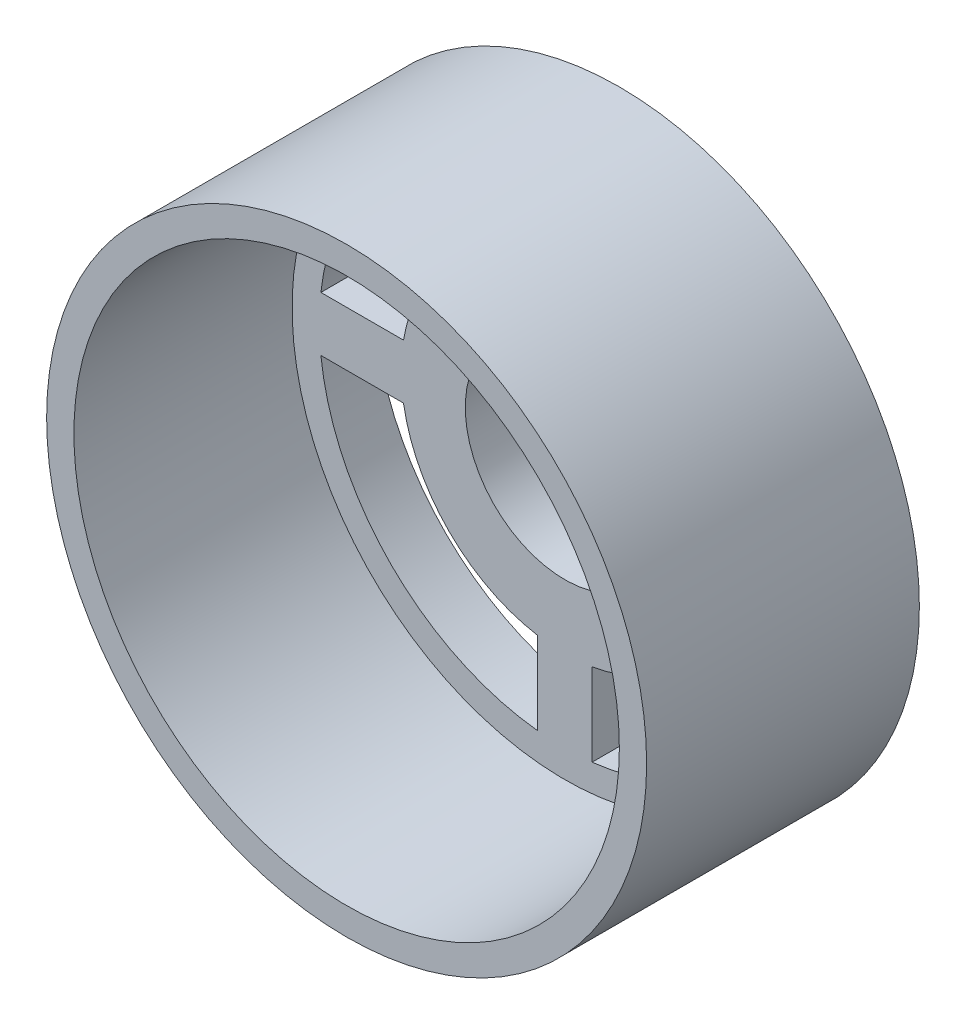
ISO-10303-21;
HEADER;
FILE_DESCRIPTION(('STEP AP214'),'2;1');
FILE_NAME('part.step','',(''),(''),'','','');
FILE_SCHEMA(('AUTOMOTIVE_DESIGN { 1 0 10303 214 1 1 1 1 }'));
ENDSEC;
DATA;
#1=APPLICATION_CONTEXT('core data for automotive mechanical design processes');
#2=APPLICATION_PROTOCOL_DEFINITION('international standard','automotive_design',2000,#1);
#3=PRODUCT_CONTEXT('',#1,'mechanical');
#4=PRODUCT('Part','Part','',(#3));
#5=PRODUCT_RELATED_PRODUCT_CATEGORY('part','',(#4));
#6=PRODUCT_DEFINITION_FORMATION('','',#4);
#7=PRODUCT_DEFINITION_CONTEXT('part definition',#1,'design');
#8=PRODUCT_DEFINITION('design','',#6,#7);
#9=PRODUCT_DEFINITION_SHAPE('','',#8);
#10=(LENGTH_UNIT() NAMED_UNIT(*) SI_UNIT(.MILLI.,.METRE.));
#11=(NAMED_UNIT(*) PLANE_ANGLE_UNIT() SI_UNIT($,.RADIAN.));
#12=(NAMED_UNIT(*) SI_UNIT($,.STERADIAN.) SOLID_ANGLE_UNIT());
#13=UNCERTAINTY_MEASURE_WITH_UNIT(LENGTH_MEASURE(1.E-05),#10,'distance_accuracy_value','');
#14=(GEOMETRIC_REPRESENTATION_CONTEXT(3) GLOBAL_UNCERTAINTY_ASSIGNED_CONTEXT((#13)) GLOBAL_UNIT_ASSIGNED_CONTEXT((#10,
#11,#12)) REPRESENTATION_CONTEXT('',''));
#15=CARTESIAN_POINT('',(0.,0.,0.));
#16=DIRECTION('',(0.,0.,1.));
#17=DIRECTION('',(1.,0.,0.));
#18=AXIS2_PLACEMENT_3D('',#15,#16,#17);
#19=CARTESIAN_POINT('',(0.,0.,2.));
#20=DIRECTION('',(0.,0.,1.));
#21=DIRECTION('',(1.,0.,0.));
#22=AXIS2_PLACEMENT_3D('',#19,#20,#21);
#23=PLANE('',#22);
#24=CARTESIAN_POINT('',(0.,0.,2.));
#25=DIRECTION('',(0.,0.,1.));
#26=DIRECTION('',(1.,0.,0.));
#27=AXIS2_PLACEMENT_3D('',#24,#25,#26);
#28=CIRCLE('',#27,9.);
#29=CARTESIAN_POINT('',(1.,-8.94427190999916,2.));
#30=VERTEX_POINT('',#29);
#31=CARTESIAN_POINT('',(8.94427190999916,-1.,2.));
#32=VERTEX_POINT('',#31);
#33=EDGE_CURVE('E267',#30,#32,#28,.T.);
#34=ORIENTED_EDGE('',*,*,#33,.F.);
#35=DIRECTION('',(0.,-1.,0.));
#36=VECTOR('',#35,1.);
#37=CARTESIAN_POINT('',(1.,0.,2.));
#38=LINE('',#37,#36);
#39=CARTESIAN_POINT('',(1.,-5.91607978309962,2.));
#40=VERTEX_POINT('',#39);
#41=EDGE_CURVE('E261',#40,#30,#38,.T.);
#42=ORIENTED_EDGE('',*,*,#41,.F.);
#43=CARTESIAN_POINT('',(0.,0.,2.));
#44=DIRECTION('',(0.,0.,1.));
#45=DIRECTION('',(1.,0.,0.));
#46=AXIS2_PLACEMENT_3D('',#43,#44,#45);
#47=CIRCLE('',#46,6.);
#48=CARTESIAN_POINT('',(5.91607978309962,-0.999999999999999,2.));
#49=VERTEX_POINT('',#48);
#50=EDGE_CURVE('E263',#49,#40,#47,.F.);
#51=ORIENTED_EDGE('',*,*,#50,.F.);
#52=DIRECTION('',(-1.,0.,0.));
#53=VECTOR('',#52,1.);
#54=CARTESIAN_POINT('',(0.,-1.,2.));
#55=LINE('',#54,#53);
#56=EDGE_CURVE('E265',#32,#49,#55,.T.);
#57=ORIENTED_EDGE('',*,*,#56,.F.);
#58=EDGE_LOOP('',(#34,#42,#51,#57));
#59=FACE_BOUND('',#58,.T.);
#60=CARTESIAN_POINT('',(0.,0.,2.));
#61=DIRECTION('',(0.,0.,1.));
#62=DIRECTION('',(1.,0.,0.));
#63=AXIS2_PLACEMENT_3D('',#60,#61,#62);
#64=CIRCLE('',#63,9.);
#65=CARTESIAN_POINT('',(-1.,8.94427190999916,2.));
#66=VERTEX_POINT('',#65);
#67=CARTESIAN_POINT('',(-8.94427190999916,1.,2.));
#68=VERTEX_POINT('',#67);
#69=EDGE_CURVE('E259',#66,#68,#64,.T.);
#70=ORIENTED_EDGE('',*,*,#69,.F.);
#71=DIRECTION('',(0.,1.,0.));
#72=VECTOR('',#71,1.);
#73=CARTESIAN_POINT('',(-1.,0.,2.));
#74=LINE('',#73,#72);
#75=CARTESIAN_POINT('',(-1.,5.91607978309962,2.));
#76=VERTEX_POINT('',#75);
#77=EDGE_CURVE('E253',#76,#66,#74,.T.);
#78=ORIENTED_EDGE('',*,*,#77,.F.);
#79=CARTESIAN_POINT('',(0.,0.,2.));
#80=DIRECTION('',(0.,0.,1.));
#81=DIRECTION('',(1.,0.,0.));
#82=AXIS2_PLACEMENT_3D('',#79,#80,#81);
#83=CIRCLE('',#82,6.);
#84=CARTESIAN_POINT('',(-5.91607978309962,0.999999999999999,2.));
#85=VERTEX_POINT('',#84);
#86=EDGE_CURVE('E255',#85,#76,#83,.F.);
#87=ORIENTED_EDGE('',*,*,#86,.F.);
#88=DIRECTION('',(1.,0.,0.));
#89=VECTOR('',#88,1.);
#90=CARTESIAN_POINT('',(0.,1.,2.));
#91=LINE('',#90,#89);
#92=EDGE_CURVE('E257',#68,#85,#91,.T.);
#93=ORIENTED_EDGE('',*,*,#92,.F.);
#94=EDGE_LOOP('',(#70,#78,#87,#93));
#95=FACE_BOUND('',#94,.T.);
#96=CARTESIAN_POINT('',(0.,0.,2.));
#97=DIRECTION('',(0.,0.,1.));
#98=DIRECTION('',(1.,0.,0.));
#99=AXIS2_PLACEMENT_3D('',#96,#97,#98);
#100=CIRCLE('',#99,9.);
#101=CARTESIAN_POINT('',(-8.94427190999916,-1.,2.));
#102=VERTEX_POINT('',#101);
#103=CARTESIAN_POINT('',(-1.,-8.94427190999916,2.));
#104=VERTEX_POINT('',#103);
#105=EDGE_CURVE('E157',#102,#104,#100,.T.);
#106=ORIENTED_EDGE('',*,*,#105,.F.);
#107=DIRECTION('',(-1.,0.,0.));
#108=VECTOR('',#107,1.);
#109=CARTESIAN_POINT('',(0.,-1.,2.));
#110=LINE('',#109,#108);
#111=CARTESIAN_POINT('',(-5.91607978309962,-1.,2.));
#112=VERTEX_POINT('',#111);
#113=EDGE_CURVE('E245',#112,#102,#110,.T.);
#114=ORIENTED_EDGE('',*,*,#113,.F.);
#115=CARTESIAN_POINT('',(0.,0.,2.));
#116=DIRECTION('',(0.,0.,1.));
#117=DIRECTION('',(1.,0.,0.));
#118=AXIS2_PLACEMENT_3D('',#115,#116,#117);
#119=CIRCLE('',#118,6.);
#120=CARTESIAN_POINT('',(-1.,-5.91607978309962,2.));
#121=VERTEX_POINT('',#120);
#122=EDGE_CURVE('E247',#121,#112,#119,.F.);
#123=ORIENTED_EDGE('',*,*,#122,.F.);
#124=DIRECTION('',(0.,1.,0.));
#125=VECTOR('',#124,1.);
#126=CARTESIAN_POINT('',(-1.,0.,2.));
#127=LINE('',#126,#125);
#128=EDGE_CURVE('E250',#104,#121,#127,.T.);
#129=ORIENTED_EDGE('',*,*,#128,.F.);
#130=EDGE_LOOP('',(#106,#114,#123,#129));
#131=FACE_BOUND('',#130,.T.);
#132=CARTESIAN_POINT('',(0.,0.,2.));
#133=DIRECTION('',(0.,0.,1.));
#134=DIRECTION('',(1.,0.,0.));
#135=AXIS2_PLACEMENT_3D('',#132,#133,#134);
#136=CIRCLE('',#135,9.);
#137=CARTESIAN_POINT('',(8.94427190999916,1.,2.));
#138=VERTEX_POINT('',#137);
#139=CARTESIAN_POINT('',(1.,8.94427190999916,2.));
#140=VERTEX_POINT('',#139);
#141=EDGE_CURVE('E243',#138,#140,#136,.T.);
#142=ORIENTED_EDGE('',*,*,#141,.F.);
#143=DIRECTION('',(1.,0.,0.));
#144=VECTOR('',#143,1.);
#145=CARTESIAN_POINT('',(0.,1.,2.));
#146=LINE('',#145,#144);
#147=CARTESIAN_POINT('',(5.91607978309962,1.,2.));
#148=VERTEX_POINT('',#147);
#149=EDGE_CURVE('E230',#148,#138,#146,.T.);
#150=ORIENTED_EDGE('',*,*,#149,.F.);
#151=CARTESIAN_POINT('',(0.,0.,2.));
#152=DIRECTION('',(0.,0.,1.));
#153=DIRECTION('',(1.,0.,0.));
#154=AXIS2_PLACEMENT_3D('',#151,#152,#153);
#155=CIRCLE('',#154,6.);
#156=CARTESIAN_POINT('',(1.,5.91607978309962,2.));
#157=VERTEX_POINT('',#156);
#158=EDGE_CURVE('E238',#157,#148,#155,.F.);
#159=ORIENTED_EDGE('',*,*,#158,.F.);
#160=DIRECTION('',(0.,-1.,0.));
#161=VECTOR('',#160,1.);
#162=CARTESIAN_POINT('',(1.,0.,2.));
#163=LINE('',#162,#161);
#164=EDGE_CURVE('E241',#140,#157,#163,.T.);
#165=ORIENTED_EDGE('',*,*,#164,.F.);
#166=EDGE_LOOP('',(#142,#150,#159,#165));
#167=FACE_BOUND('',#166,.T.);
#168=CARTESIAN_POINT('',(0.,0.,2.));
#169=DIRECTION('',(0.,0.,1.));
#170=DIRECTION('',(1.,0.,0.));
#171=AXIS2_PLACEMENT_3D('',#168,#169,#170);
#172=CIRCLE('',#171,10.);
#173=CARTESIAN_POINT('',(10.,0.,2.));
#174=VERTEX_POINT('',#173);
#175=EDGE_CURVE('E276',#174,#174,#172,.F.);
#176=ORIENTED_EDGE('',*,*,#175,.F.);
#177=EDGE_LOOP('',(#176));
#178=FACE_BOUND('',#177,.T.);
#179=CARTESIAN_POINT('',(0.,0.,2.));
#180=DIRECTION('',(0.,0.,1.));
#181=DIRECTION('',(1.,0.,0.));
#182=AXIS2_PLACEMENT_3D('',#179,#180,#181);
#183=CIRCLE('',#182,3.65);
#184=CARTESIAN_POINT('',(3.65,0.,2.));
#185=VERTEX_POINT('',#184);
#186=EDGE_CURVE('E11',#185,#185,#183,.T.);
#187=ORIENTED_EDGE('',*,*,#186,.F.);
#188=EDGE_LOOP('',(#187));
#189=FACE_BOUND('',#188,.T.);
#190=ADVANCED_FACE('F37',(#59,#95,#131,#167,#178,#189),#23,.T.);
#191=CARTESIAN_POINT('',(0.,0.,0.));
#192=DIRECTION('',(0.,0.,1.));
#193=DIRECTION('',(1.,0.,0.));
#194=AXIS2_PLACEMENT_3D('',#191,#192,#193);
#195=PLANE('',#194);
#196=DIRECTION('',(0.,1.,0.));
#197=VECTOR('',#196,1.);
#198=CARTESIAN_POINT('',(1.,-6.,0.));
#199=LINE('',#198,#197);
#200=CARTESIAN_POINT('',(1.,-8.94427190999916,0.));
#201=VERTEX_POINT('',#200);
#202=CARTESIAN_POINT('',(0.999999999999999,-5.91607978309962,0.));
#203=VERTEX_POINT('',#202);
#204=EDGE_CURVE('E198',#201,#203,#199,.T.);
#205=ORIENTED_EDGE('',*,*,#204,.F.);
#206=CARTESIAN_POINT('',(0.,0.,0.));
#207=DIRECTION('',(0.,0.,-1.));
#208=DIRECTION('',(-1.,0.,0.));
#209=AXIS2_PLACEMENT_3D('',#206,#207,#208);
#210=CIRCLE('',#209,9.);
#211=CARTESIAN_POINT('',(8.94427190999916,-1.,0.));
#212=VERTEX_POINT('',#211);
#213=EDGE_CURVE('E200',#212,#201,#210,.T.);
#214=ORIENTED_EDGE('',*,*,#213,.F.);
#215=DIRECTION('',(1.,0.,0.));
#216=VECTOR('',#215,1.);
#217=CARTESIAN_POINT('',(8.94427190999916,-1.,0.));
#218=LINE('',#217,#216);
#219=CARTESIAN_POINT('',(5.91607978309962,-0.999999999999999,0.));
#220=VERTEX_POINT('',#219);
#221=EDGE_CURVE('E186',#220,#212,#218,.T.);
#222=ORIENTED_EDGE('',*,*,#221,.F.);
#223=CARTESIAN_POINT('',(0.,0.,0.));
#224=DIRECTION('',(0.,0.,1.));
#225=DIRECTION('',(-1.,0.,0.));
#226=AXIS2_PLACEMENT_3D('',#223,#224,#225);
#227=CIRCLE('',#226,6.);
#228=EDGE_CURVE('E195',#203,#220,#227,.T.);
#229=ORIENTED_EDGE('',*,*,#228,.F.);
#230=EDGE_LOOP('',(#205,#214,#222,#229));
#231=FACE_BOUND('',#230,.T.);
#232=DIRECTION('',(0.,-1.,0.));
#233=VECTOR('',#232,1.);
#234=CARTESIAN_POINT('',(-1.,6.,0.));
#235=LINE('',#234,#233);
#236=CARTESIAN_POINT('',(-1.,8.94427190999916,0.));
#237=VERTEX_POINT('',#236);
#238=CARTESIAN_POINT('',(-1.,5.91607978309962,0.));
#239=VERTEX_POINT('',#238);
#240=EDGE_CURVE('E214',#237,#239,#235,.T.);
#241=ORIENTED_EDGE('',*,*,#240,.F.);
#242=CARTESIAN_POINT('',(0.,0.,0.));
#243=DIRECTION('',(0.,0.,-1.));
#244=DIRECTION('',(-1.,0.,0.));
#245=AXIS2_PLACEMENT_3D('',#242,#243,#244);
#246=CIRCLE('',#245,9.);
#247=CARTESIAN_POINT('',(-8.94427190999916,1.,0.));
#248=VERTEX_POINT('',#247);
#249=EDGE_CURVE('E192',#248,#237,#246,.T.);
#250=ORIENTED_EDGE('',*,*,#249,.F.);
#251=DIRECTION('',(-1.,0.,0.));
#252=VECTOR('',#251,1.);
#253=CARTESIAN_POINT('',(-6.,1.,0.));
#254=LINE('',#253,#252);
#255=CARTESIAN_POINT('',(-5.91607978309962,0.999999999999999,0.));
#256=VERTEX_POINT('',#255);
#257=EDGE_CURVE('E206',#256,#248,#254,.T.);
#258=ORIENTED_EDGE('',*,*,#257,.F.);
#259=CARTESIAN_POINT('',(0.,0.,0.));
#260=DIRECTION('',(0.,0.,1.));
#261=DIRECTION('',(-1.,0.,0.));
#262=AXIS2_PLACEMENT_3D('',#259,#260,#261);
#263=CIRCLE('',#262,6.);
#264=EDGE_CURVE('E211',#239,#256,#263,.T.);
#265=ORIENTED_EDGE('',*,*,#264,.F.);
#266=EDGE_LOOP('',(#241,#250,#258,#265));
#267=FACE_BOUND('',#266,.T.);
#268=DIRECTION('',(1.,0.,0.));
#269=VECTOR('',#268,1.);
#270=CARTESIAN_POINT('',(-6.,-1.,0.));
#271=LINE('',#270,#269);
#272=CARTESIAN_POINT('',(-8.94427190999916,-1.,0.));
#273=VERTEX_POINT('',#272);
#274=CARTESIAN_POINT('',(-5.91607978309962,-0.999999999999999,0.));
#275=VERTEX_POINT('',#274);
#276=EDGE_CURVE('E175',#273,#275,#271,.T.);
#277=ORIENTED_EDGE('',*,*,#276,.F.);
#278=CARTESIAN_POINT('',(0.,0.,0.));
#279=DIRECTION('',(0.,0.,-1.));
#280=DIRECTION('',(-1.,0.,0.));
#281=AXIS2_PLACEMENT_3D('',#278,#279,#280);
#282=CIRCLE('',#281,9.);
#283=CARTESIAN_POINT('',(-1.,-8.94427190999916,0.));
#284=VERTEX_POINT('',#283);
#285=EDGE_CURVE('E154',#284,#273,#282,.T.);
#286=ORIENTED_EDGE('',*,*,#285,.F.);
#287=DIRECTION('',(0.,-1.,0.));
#288=VECTOR('',#287,1.);
#289=CARTESIAN_POINT('',(-1.,-6.,0.));
#290=LINE('',#289,#288);
#291=CARTESIAN_POINT('',(-1.,-5.91607978309962,0.));
#292=VERTEX_POINT('',#291);
#293=EDGE_CURVE('E163',#292,#284,#290,.T.);
#294=ORIENTED_EDGE('',*,*,#293,.F.);
#295=CARTESIAN_POINT('',(0.,0.,0.));
#296=DIRECTION('',(0.,0.,1.));
#297=DIRECTION('',(-1.,0.,0.));
#298=AXIS2_PLACEMENT_3D('',#295,#296,#297);
#299=CIRCLE('',#298,6.);
#300=EDGE_CURVE('E169',#275,#292,#299,.T.);
#301=ORIENTED_EDGE('',*,*,#300,.F.);
#302=EDGE_LOOP('',(#277,#286,#294,#301));
#303=FACE_BOUND('',#302,.T.);
#304=DIRECTION('',(-1.,0.,0.));
#305=VECTOR('',#304,1.);
#306=CARTESIAN_POINT('',(6.,1.,0.));
#307=LINE('',#306,#305);
#308=CARTESIAN_POINT('',(8.94427190999916,1.,0.));
#309=VERTEX_POINT('',#308);
#310=CARTESIAN_POINT('',(5.91607978309962,1.,0.));
#311=VERTEX_POINT('',#310);
#312=EDGE_CURVE('E218',#309,#311,#307,.T.);
#313=ORIENTED_EDGE('',*,*,#312,.F.);
#314=CARTESIAN_POINT('',(0.,0.,0.));
#315=DIRECTION('',(0.,0.,-1.));
#316=DIRECTION('',(-1.,0.,0.));
#317=AXIS2_PLACEMENT_3D('',#314,#315,#316);
#318=CIRCLE('',#317,9.);
#319=CARTESIAN_POINT('',(1.,8.94427190999916,0.));
#320=VERTEX_POINT('',#319);
#321=EDGE_CURVE('E202',#320,#309,#318,.T.);
#322=ORIENTED_EDGE('',*,*,#321,.F.);
#323=DIRECTION('',(0.,1.,0.));
#324=VECTOR('',#323,1.);
#325=CARTESIAN_POINT('',(1.,6.,0.));
#326=LINE('',#325,#324);
#327=CARTESIAN_POINT('',(1.,5.91607978309962,0.));
#328=VERTEX_POINT('',#327);
#329=EDGE_CURVE('E224',#328,#320,#326,.T.);
#330=ORIENTED_EDGE('',*,*,#329,.F.);
#331=CARTESIAN_POINT('',(0.,0.,0.));
#332=DIRECTION('',(0.,0.,1.));
#333=DIRECTION('',(-1.,0.,0.));
#334=AXIS2_PLACEMENT_3D('',#331,#332,#333);
#335=CIRCLE('',#334,6.);
#336=EDGE_CURVE('E221',#311,#328,#335,.T.);
#337=ORIENTED_EDGE('',*,*,#336,.F.);
#338=EDGE_LOOP('',(#313,#322,#330,#337));
#339=FACE_BOUND('',#338,.T.);
#340=CARTESIAN_POINT('',(0.,0.,0.));
#341=DIRECTION('',(0.,0.,1.));
#342=DIRECTION('',(1.,0.,0.));
#343=AXIS2_PLACEMENT_3D('',#340,#341,#342);
#344=CIRCLE('',#343,3.65);
#345=CARTESIAN_POINT('',(3.65,0.,0.));
#346=VERTEX_POINT('',#345);
#347=EDGE_CURVE('E41',#346,#346,#344,.T.);
#348=ORIENTED_EDGE('',*,*,#347,.T.);
#349=EDGE_LOOP('',(#348));
#350=FACE_BOUND('',#349,.T.);
#351=CARTESIAN_POINT('',(0.,0.,0.));
#352=DIRECTION('',(0.,0.,1.));
#353=DIRECTION('',(1.,0.,0.));
#354=AXIS2_PLACEMENT_3D('',#351,#352,#353);
#355=CIRCLE('',#354,11.);
#356=CARTESIAN_POINT('',(11.,0.,0.));
#357=VERTEX_POINT('',#356);
#358=EDGE_CURVE('E272',#357,#357,#355,.T.);
#359=ORIENTED_EDGE('',*,*,#358,.F.);
#360=EDGE_LOOP('',(#359));
#361=FACE_BOUND('',#360,.T.);
#362=ADVANCED_FACE('F39',(#231,#267,#303,#339,#350,#361),#195,.F.);
#363=CARTESIAN_POINT('',(0.,0.,2.));
#364=DIRECTION('',(0.,0.,-1.));
#365=DIRECTION('',(-1.,0.,0.));
#366=AXIS2_PLACEMENT_3D('',#363,#364,#365);
#367=CYLINDRICAL_SURFACE('',#366,3.65);
#368=ORIENTED_EDGE('',*,*,#186,.T.);
#369=EDGE_LOOP('',(#368));
#370=FACE_BOUND('',#369,.T.);
#371=ORIENTED_EDGE('',*,*,#347,.F.);
#372=EDGE_LOOP('',(#371));
#373=FACE_BOUND('',#372,.T.);
#374=ADVANCED_FACE('F287',(#370,#373),#367,.F.);
#375=CARTESIAN_POINT('',(0.,0.,10.));
#376=DIRECTION('',(0.,0.,1.));
#377=DIRECTION('',(1.,0.,0.));
#378=AXIS2_PLACEMENT_3D('',#375,#376,#377);
#379=PLANE('',#378);
#380=CARTESIAN_POINT('',(0.,0.,10.));
#381=DIRECTION('',(0.,0.,1.));
#382=DIRECTION('',(1.,0.,0.));
#383=AXIS2_PLACEMENT_3D('',#380,#381,#382);
#384=CIRCLE('',#383,11.);
#385=CARTESIAN_POINT('',(11.,0.,10.));
#386=VERTEX_POINT('',#385);
#387=EDGE_CURVE('E273',#386,#386,#384,.T.);
#388=ORIENTED_EDGE('',*,*,#387,.T.);
#389=EDGE_LOOP('',(#388));
#390=FACE_BOUND('',#389,.T.);
#391=CARTESIAN_POINT('',(0.,0.,10.));
#392=DIRECTION('',(0.,0.,1.));
#393=DIRECTION('',(1.,0.,0.));
#394=AXIS2_PLACEMENT_3D('',#391,#392,#393);
#395=CIRCLE('',#394,10.);
#396=CARTESIAN_POINT('',(10.,0.,10.));
#397=VERTEX_POINT('',#396);
#398=EDGE_CURVE('E269',#397,#397,#395,.T.);
#399=ORIENTED_EDGE('',*,*,#398,.F.);
#400=EDGE_LOOP('',(#399));
#401=FACE_BOUND('',#400,.T.);
#402=ADVANCED_FACE('F289',(#390,#401),#379,.T.);
#403=CARTESIAN_POINT('',(0.,0.,10.));
#404=DIRECTION('',(0.,0.,-1.));
#405=DIRECTION('',(-1.,0.,0.));
#406=AXIS2_PLACEMENT_3D('',#403,#404,#405);
#407=CYLINDRICAL_SURFACE('',#406,11.);
#408=ORIENTED_EDGE('',*,*,#387,.F.);
#409=EDGE_LOOP('',(#408));
#410=FACE_BOUND('',#409,.T.);
#411=ORIENTED_EDGE('',*,*,#358,.T.);
#412=EDGE_LOOP('',(#411));
#413=FACE_BOUND('',#412,.T.);
#414=ADVANCED_FACE('F296',(#410,#413),#407,.T.);
#415=CARTESIAN_POINT('',(0.,0.,10.));
#416=DIRECTION('',(0.,0.,-1.));
#417=DIRECTION('',(-1.,0.,0.));
#418=AXIS2_PLACEMENT_3D('',#415,#416,#417);
#419=CYLINDRICAL_SURFACE('',#418,10.);
#420=ORIENTED_EDGE('',*,*,#175,.T.);
#421=EDGE_LOOP('',(#420));
#422=FACE_BOUND('',#421,.T.);
#423=ORIENTED_EDGE('',*,*,#398,.T.);
#424=EDGE_LOOP('',(#423));
#425=FACE_BOUND('',#424,.T.);
#426=ADVANCED_FACE('F349',(#422,#425),#419,.F.);
#427=CARTESIAN_POINT('',(0.,0.,10.));
#428=DIRECTION('',(0.,0.,-1.));
#429=DIRECTION('',(-1.,0.,0.));
#430=AXIS2_PLACEMENT_3D('',#427,#428,#429);
#431=CYLINDRICAL_SURFACE('',#430,9.);
#432=ORIENTED_EDGE('',*,*,#141,.T.);
#433=DIRECTION('',(0.,0.,-1.));
#434=VECTOR('',#433,1.);
#435=CARTESIAN_POINT('',(1.,8.94427190999916,10.));
#436=LINE('',#435,#434);
#437=EDGE_CURVE('E228',#140,#320,#436,.T.);
#438=ORIENTED_EDGE('',*,*,#437,.T.);
#439=ORIENTED_EDGE('',*,*,#321,.T.);
#440=DIRECTION('',(0.,0.,-1.));
#441=VECTOR('',#440,1.);
#442=CARTESIAN_POINT('',(8.94427190999916,1.,10.));
#443=LINE('',#442,#441);
#444=EDGE_CURVE('E227',#138,#309,#443,.T.);
#445=ORIENTED_EDGE('',*,*,#444,.F.);
#446=EDGE_LOOP('',(#432,#438,#439,#445));
#447=FACE_BOUND('',#446,.T.);
#448=ADVANCED_FACE('F325',(#447),#431,.F.);
#449=CARTESIAN_POINT('',(1.,6.,10.));
#450=DIRECTION('',(-1.,0.,0.));
#451=DIRECTION('',(0.,0.,1.));
#452=AXIS2_PLACEMENT_3D('',#449,#450,#451);
#453=PLANE('',#452);
#454=ORIENTED_EDGE('',*,*,#164,.T.);
#455=DIRECTION('',(0.,0.,-1.));
#456=VECTOR('',#455,1.);
#457=CARTESIAN_POINT('',(1.,5.91607978309962,10.));
#458=LINE('',#457,#456);
#459=EDGE_CURVE('E231',#157,#328,#458,.T.);
#460=ORIENTED_EDGE('',*,*,#459,.T.);
#461=ORIENTED_EDGE('',*,*,#329,.T.);
#462=ORIENTED_EDGE('',*,*,#437,.F.);
#463=EDGE_LOOP('',(#454,#460,#461,#462));
#464=FACE_BOUND('',#463,.T.);
#465=ADVANCED_FACE('F327',(#464),#453,.F.);
#466=CARTESIAN_POINT('',(0.,0.,10.));
#467=DIRECTION('',(0.,0.,-1.));
#468=DIRECTION('',(-1.,0.,0.));
#469=AXIS2_PLACEMENT_3D('',#466,#467,#468);
#470=CYLINDRICAL_SURFACE('',#469,6.);
#471=ORIENTED_EDGE('',*,*,#158,.T.);
#472=DIRECTION('',(0.,0.,-1.));
#473=VECTOR('',#472,1.);
#474=CARTESIAN_POINT('',(5.91607978309962,1.,10.));
#475=LINE('',#474,#473);
#476=EDGE_CURVE('E233',#148,#311,#475,.T.);
#477=ORIENTED_EDGE('',*,*,#476,.T.);
#478=ORIENTED_EDGE('',*,*,#336,.T.);
#479=ORIENTED_EDGE('',*,*,#459,.F.);
#480=EDGE_LOOP('',(#471,#477,#478,#479));
#481=FACE_BOUND('',#480,.T.);
#482=ADVANCED_FACE('F336',(#481),#470,.T.);
#483=CARTESIAN_POINT('',(6.,1.,10.));
#484=DIRECTION('',(0.,-1.,0.));
#485=DIRECTION('',(0.,0.,-1.));
#486=AXIS2_PLACEMENT_3D('',#483,#484,#485);
#487=PLANE('',#486);
#488=ORIENTED_EDGE('',*,*,#149,.T.);
#489=ORIENTED_EDGE('',*,*,#444,.T.);
#490=ORIENTED_EDGE('',*,*,#312,.T.);
#491=ORIENTED_EDGE('',*,*,#476,.F.);
#492=EDGE_LOOP('',(#488,#489,#490,#491));
#493=FACE_BOUND('',#492,.T.);
#494=ADVANCED_FACE('F334',(#493),#487,.F.);
#495=CARTESIAN_POINT('',(0.,0.,10.));
#496=DIRECTION('',(0.,0.,-1.));
#497=DIRECTION('',(-1.,0.,0.));
#498=AXIS2_PLACEMENT_3D('',#495,#496,#497);
#499=CYLINDRICAL_SURFACE('',#498,9.);
#500=ORIENTED_EDGE('',*,*,#105,.T.);
#501=DIRECTION('',(0.,0.,-1.));
#502=VECTOR('',#501,1.);
#503=CARTESIAN_POINT('',(-1.,-8.94427190999916,10.));
#504=LINE('',#503,#502);
#505=EDGE_CURVE('E149',#104,#284,#504,.T.);
#506=ORIENTED_EDGE('',*,*,#505,.T.);
#507=ORIENTED_EDGE('',*,*,#285,.T.);
#508=DIRECTION('',(0.,0.,-1.));
#509=VECTOR('',#508,1.);
#510=CARTESIAN_POINT('',(-8.94427190999916,-1.,10.));
#511=LINE('',#510,#509);
#512=EDGE_CURVE('E170',#102,#273,#511,.T.);
#513=ORIENTED_EDGE('',*,*,#512,.F.);
#514=EDGE_LOOP('',(#500,#506,#507,#513));
#515=FACE_BOUND('',#514,.T.);
#516=ADVANCED_FACE('F151',(#515),#499,.F.);
#517=CARTESIAN_POINT('',(-1.,-6.,10.));
#518=DIRECTION('',(1.,0.,0.));
#519=DIRECTION('',(0.,0.,-1.));
#520=AXIS2_PLACEMENT_3D('',#517,#518,#519);
#521=PLANE('',#520);
#522=ORIENTED_EDGE('',*,*,#128,.T.);
#523=DIRECTION('',(0.,0.,-1.));
#524=VECTOR('',#523,1.);
#525=CARTESIAN_POINT('',(-1.,-5.91607978309962,10.));
#526=LINE('',#525,#524);
#527=EDGE_CURVE('E160',#121,#292,#526,.T.);
#528=ORIENTED_EDGE('',*,*,#527,.T.);
#529=ORIENTED_EDGE('',*,*,#293,.T.);
#530=ORIENTED_EDGE('',*,*,#505,.F.);
#531=EDGE_LOOP('',(#522,#528,#529,#530));
#532=FACE_BOUND('',#531,.T.);
#533=ADVANCED_FACE('F164',(#532),#521,.F.);
#534=CARTESIAN_POINT('',(0.,0.,10.));
#535=DIRECTION('',(0.,0.,-1.));
#536=DIRECTION('',(-1.,0.,0.));
#537=AXIS2_PLACEMENT_3D('',#534,#535,#536);
#538=CYLINDRICAL_SURFACE('',#537,6.);
#539=ORIENTED_EDGE('',*,*,#122,.T.);
#540=DIRECTION('',(0.,0.,-1.));
#541=VECTOR('',#540,1.);
#542=CARTESIAN_POINT('',(-5.91607978309962,-0.999999999999999,10.));
#543=LINE('',#542,#541);
#544=EDGE_CURVE('E614',#112,#275,#543,.T.);
#545=ORIENTED_EDGE('',*,*,#544,.T.);
#546=ORIENTED_EDGE('',*,*,#300,.T.);
#547=ORIENTED_EDGE('',*,*,#527,.F.);
#548=EDGE_LOOP('',(#539,#545,#546,#547));
#549=FACE_BOUND('',#548,.T.);
#550=ADVANCED_FACE('F408',(#549),#538,.T.);
#551=CARTESIAN_POINT('',(-6.,-1.,10.));
#552=DIRECTION('',(0.,1.,0.));
#553=DIRECTION('',(0.,0.,1.));
#554=AXIS2_PLACEMENT_3D('',#551,#552,#553);
#555=PLANE('',#554);
#556=ORIENTED_EDGE('',*,*,#113,.T.);
#557=ORIENTED_EDGE('',*,*,#512,.T.);
#558=ORIENTED_EDGE('',*,*,#276,.T.);
#559=ORIENTED_EDGE('',*,*,#544,.F.);
#560=EDGE_LOOP('',(#556,#557,#558,#559));
#561=FACE_BOUND('',#560,.T.);
#562=ADVANCED_FACE('F417',(#561),#555,.F.);
#563=CARTESIAN_POINT('',(0.,0.,10.));
#564=DIRECTION('',(0.,0.,-1.));
#565=DIRECTION('',(-1.,0.,0.));
#566=AXIS2_PLACEMENT_3D('',#563,#564,#565);
#567=CYLINDRICAL_SURFACE('',#566,9.);
#568=ORIENTED_EDGE('',*,*,#69,.T.);
#569=DIRECTION('',(0.,0.,-1.));
#570=VECTOR('',#569,1.);
#571=CARTESIAN_POINT('',(-8.94427190999916,1.,10.));
#572=LINE('',#571,#570);
#573=EDGE_CURVE('E176',#68,#248,#572,.T.);
#574=ORIENTED_EDGE('',*,*,#573,.T.);
#575=ORIENTED_EDGE('',*,*,#249,.T.);
#576=DIRECTION('',(0.,0.,-1.));
#577=VECTOR('',#576,1.);
#578=CARTESIAN_POINT('',(-1.,8.94427190999916,10.));
#579=LINE('',#578,#577);
#580=EDGE_CURVE('E203',#66,#237,#579,.T.);
#581=ORIENTED_EDGE('',*,*,#580,.F.);
#582=EDGE_LOOP('',(#568,#574,#575,#581));
#583=FACE_BOUND('',#582,.T.);
#584=ADVANCED_FACE('F429',(#583),#567,.F.);
#585=CARTESIAN_POINT('',(-6.,1.,10.));
#586=DIRECTION('',(0.,-1.,0.));
#587=DIRECTION('',(0.,0.,-1.));
#588=AXIS2_PLACEMENT_3D('',#585,#586,#587);
#589=PLANE('',#588);
#590=ORIENTED_EDGE('',*,*,#92,.T.);
#591=DIRECTION('',(0.,0.,-1.));
#592=VECTOR('',#591,1.);
#593=CARTESIAN_POINT('',(-5.91607978309962,0.999999999999999,10.));
#594=LINE('',#593,#592);
#595=EDGE_CURVE('E178',#85,#256,#594,.T.);
#596=ORIENTED_EDGE('',*,*,#595,.T.);
#597=ORIENTED_EDGE('',*,*,#257,.T.);
#598=ORIENTED_EDGE('',*,*,#573,.F.);
#599=EDGE_LOOP('',(#590,#596,#597,#598));
#600=FACE_BOUND('',#599,.T.);
#601=ADVANCED_FACE('F439',(#600),#589,.F.);
#602=CARTESIAN_POINT('',(0.,0.,10.));
#603=DIRECTION('',(0.,0.,-1.));
#604=DIRECTION('',(-1.,0.,0.));
#605=AXIS2_PLACEMENT_3D('',#602,#603,#604);
#606=CYLINDRICAL_SURFACE('',#605,6.);
#607=ORIENTED_EDGE('',*,*,#86,.T.);
#608=DIRECTION('',(0.,0.,-1.));
#609=VECTOR('',#608,1.);
#610=CARTESIAN_POINT('',(-1.,5.91607978309962,10.));
#611=LINE('',#610,#609);
#612=EDGE_CURVE('E60',#76,#239,#611,.T.);
#613=ORIENTED_EDGE('',*,*,#612,.T.);
#614=ORIENTED_EDGE('',*,*,#264,.T.);
#615=ORIENTED_EDGE('',*,*,#595,.F.);
#616=EDGE_LOOP('',(#607,#613,#614,#615));
#617=FACE_BOUND('',#616,.T.);
#618=ADVANCED_FACE('F451',(#617),#606,.T.);
#619=CARTESIAN_POINT('',(-1.,6.,10.));
#620=DIRECTION('',(1.,0.,0.));
#621=DIRECTION('',(0.,0.,-1.));
#622=AXIS2_PLACEMENT_3D('',#619,#620,#621);
#623=PLANE('',#622);
#624=ORIENTED_EDGE('',*,*,#77,.T.);
#625=ORIENTED_EDGE('',*,*,#580,.T.);
#626=ORIENTED_EDGE('',*,*,#240,.T.);
#627=ORIENTED_EDGE('',*,*,#612,.F.);
#628=EDGE_LOOP('',(#624,#625,#626,#627));
#629=FACE_BOUND('',#628,.T.);
#630=ADVANCED_FACE('F460',(#629),#623,.F.);
#631=CARTESIAN_POINT('',(0.,0.,10.));
#632=DIRECTION('',(0.,0.,-1.));
#633=DIRECTION('',(-1.,0.,0.));
#634=AXIS2_PLACEMENT_3D('',#631,#632,#633);
#635=CYLINDRICAL_SURFACE('',#634,9.);
#636=ORIENTED_EDGE('',*,*,#33,.T.);
#637=DIRECTION('',(0.,0.,-1.));
#638=VECTOR('',#637,1.);
#639=CARTESIAN_POINT('',(8.94427190999916,-1.,10.));
#640=LINE('',#639,#638);
#641=EDGE_CURVE('E190',#32,#212,#640,.T.);
#642=ORIENTED_EDGE('',*,*,#641,.T.);
#643=ORIENTED_EDGE('',*,*,#213,.T.);
#644=DIRECTION('',(0.,0.,-1.));
#645=VECTOR('',#644,1.);
#646=CARTESIAN_POINT('',(1.,-8.94427190999916,10.));
#647=LINE('',#646,#645);
#648=EDGE_CURVE('E183',#30,#201,#647,.T.);
#649=ORIENTED_EDGE('',*,*,#648,.F.);
#650=EDGE_LOOP('',(#636,#642,#643,#649));
#651=FACE_BOUND('',#650,.T.);
#652=ADVANCED_FACE('F472',(#651),#635,.F.);
#653=CARTESIAN_POINT('',(8.94427190999916,-1.,10.));
#654=DIRECTION('',(0.,1.,0.));
#655=DIRECTION('',(0.,0.,1.));
#656=AXIS2_PLACEMENT_3D('',#653,#654,#655);
#657=PLANE('',#656);
#658=ORIENTED_EDGE('',*,*,#56,.T.);
#659=DIRECTION('',(0.,0.,-1.));
#660=VECTOR('',#659,1.);
#661=CARTESIAN_POINT('',(5.91607978309962,-0.999999999999999,10.));
#662=LINE('',#661,#660);
#663=EDGE_CURVE('E188',#49,#220,#662,.T.);
#664=ORIENTED_EDGE('',*,*,#663,.T.);
#665=ORIENTED_EDGE('',*,*,#221,.T.);
#666=ORIENTED_EDGE('',*,*,#641,.F.);
#667=EDGE_LOOP('',(#658,#664,#665,#666));
#668=FACE_BOUND('',#667,.T.);
#669=ADVANCED_FACE('F481',(#668),#657,.F.);
#670=CARTESIAN_POINT('',(0.,0.,10.));
#671=DIRECTION('',(0.,0.,-1.));
#672=DIRECTION('',(-1.,0.,0.));
#673=AXIS2_PLACEMENT_3D('',#670,#671,#672);
#674=CYLINDRICAL_SURFACE('',#673,6.);
#675=ORIENTED_EDGE('',*,*,#50,.T.);
#676=DIRECTION('',(0.,0.,-1.));
#677=VECTOR('',#676,1.);
#678=CARTESIAN_POINT('',(0.999999999999999,-5.91607978309962,10.));
#679=LINE('',#678,#677);
#680=EDGE_CURVE('E52',#40,#203,#679,.T.);
#681=ORIENTED_EDGE('',*,*,#680,.T.);
#682=ORIENTED_EDGE('',*,*,#228,.T.);
#683=ORIENTED_EDGE('',*,*,#663,.F.);
#684=EDGE_LOOP('',(#675,#681,#682,#683));
#685=FACE_BOUND('',#684,.T.);
#686=ADVANCED_FACE('F493',(#685),#674,.T.);
#687=CARTESIAN_POINT('',(1.,-6.,10.));
#688=DIRECTION('',(-1.,0.,0.));
#689=DIRECTION('',(0.,0.,1.));
#690=AXIS2_PLACEMENT_3D('',#687,#688,#689);
#691=PLANE('',#690);
#692=ORIENTED_EDGE('',*,*,#41,.T.);
#693=ORIENTED_EDGE('',*,*,#648,.T.);
#694=ORIENTED_EDGE('',*,*,#204,.T.);
#695=ORIENTED_EDGE('',*,*,#680,.F.);
#696=EDGE_LOOP('',(#692,#693,#694,#695));
#697=FACE_BOUND('',#696,.T.);
#698=ADVANCED_FACE('F503',(#697),#691,.F.);
#699=CLOSED_SHELL('',(#190,#362,#374,#402,#414,#426,#448,#465,#482,#494,#516,#533,#550,#562,
#584,#601,#618,#630,#652,#669,#686,#698));
#700=MANIFOLD_SOLID_BREP('B2',#699);
#701=ADVANCED_BREP_SHAPE_REPRESENTATION('',(#18,#700),#14);
#702=SHAPE_DEFINITION_REPRESENTATION(#9,#701);
ENDSEC;
END-ISO-10303-21;
